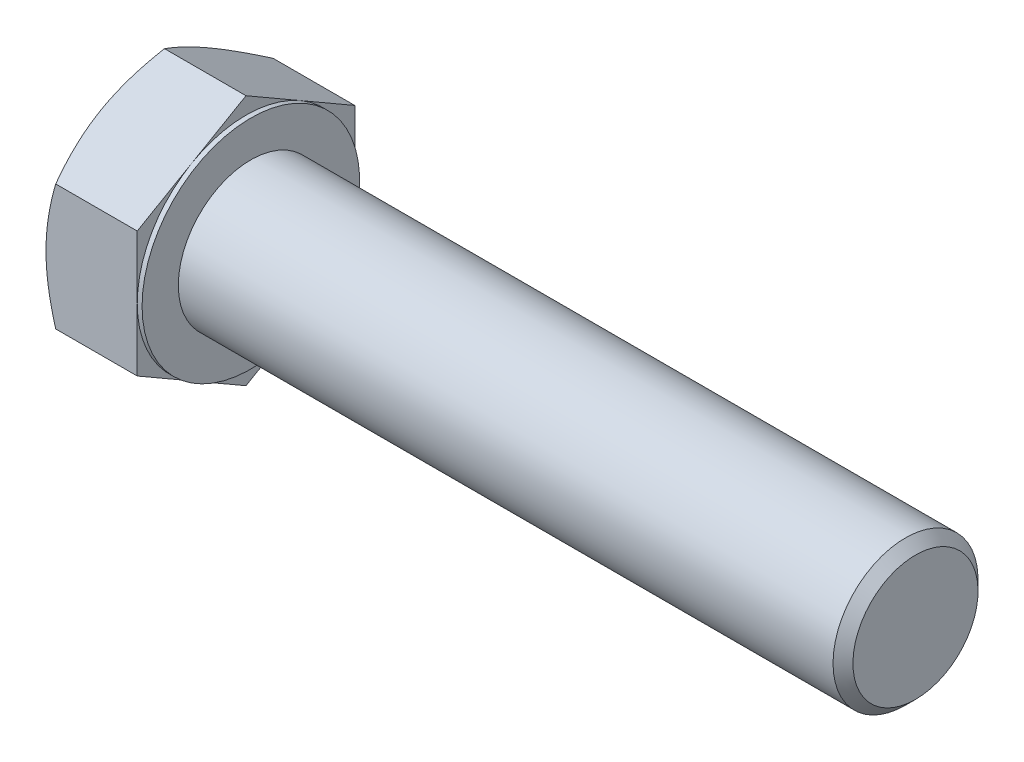
ISO-10303-21;
HEADER;
FILE_DESCRIPTION(('STEP AP214'),'2;1');
FILE_NAME('part.step','',(''),(''),'','','');
FILE_SCHEMA(('AUTOMOTIVE_DESIGN { 1 0 10303 214 1 1 1 1 }'));
ENDSEC;
DATA;
#1=APPLICATION_CONTEXT('core data for automotive mechanical design processes');
#2=APPLICATION_PROTOCOL_DEFINITION('international standard','automotive_design',2000,#1);
#3=PRODUCT_CONTEXT('',#1,'mechanical');
#4=PRODUCT('Part','Part','',(#3));
#5=PRODUCT_RELATED_PRODUCT_CATEGORY('part','',(#4));
#6=PRODUCT_DEFINITION_FORMATION('','',#4);
#7=PRODUCT_DEFINITION_CONTEXT('part definition',#1,'design');
#8=PRODUCT_DEFINITION('design','',#6,#7);
#9=PRODUCT_DEFINITION_SHAPE('','',#8);
#10=(LENGTH_UNIT() NAMED_UNIT(*) SI_UNIT(.MILLI.,.METRE.));
#11=(NAMED_UNIT(*) PLANE_ANGLE_UNIT() SI_UNIT($,.RADIAN.));
#12=(NAMED_UNIT(*) SI_UNIT($,.STERADIAN.) SOLID_ANGLE_UNIT());
#13=UNCERTAINTY_MEASURE_WITH_UNIT(LENGTH_MEASURE(1.E-05),#10,'distance_accuracy_value','');
#14=(GEOMETRIC_REPRESENTATION_CONTEXT(3) GLOBAL_UNCERTAINTY_ASSIGNED_CONTEXT((#13)) GLOBAL_UNIT_ASSIGNED_CONTEXT((#10,
#11,#12)) REPRESENTATION_CONTEXT('',''));
#15=CARTESIAN_POINT('',(0.,0.,0.));
#16=DIRECTION('',(0.,0.,1.));
#17=DIRECTION('',(1.,0.,0.));
#18=AXIS2_PLACEMENT_3D('',#15,#16,#17);
#19=CARTESIAN_POINT('',(0.,20.7846096908265,0.));
#20=DIRECTION('',(1.,0.,0.));
#21=DIRECTION('',(0.,0.,-1.));
#22=AXIS2_PLACEMENT_3D('',#19,#20,#21);
#23=PLANE('',#22);
#24=CARTESIAN_POINT('',(0.,0.,0.));
#25=DIRECTION('',(1.,0.,0.));
#26=DIRECTION('',(0.,0.,-1.));
#27=AXIS2_PLACEMENT_3D('',#24,#25,#26);
#28=CIRCLE('',#27,18.);
#29=CARTESIAN_POINT('',(0.,-15.5884572681199,-9.00000000000001));
#30=VERTEX_POINT('',#29);
#31=CARTESIAN_POINT('',(0.,0.,-18.));
#32=VERTEX_POINT('',#31);
#33=EDGE_CURVE('E85',#30,#32,#28,.T.);
#34=ORIENTED_EDGE('',*,*,#33,.F.);
#35=CARTESIAN_POINT('',(0.,0.,0.));
#36=DIRECTION('',(1.,0.,0.));
#37=DIRECTION('',(0.,1.,0.));
#38=AXIS2_PLACEMENT_3D('',#35,#36,#37);
#39=CIRCLE('',#38,18.);
#40=CARTESIAN_POINT('',(0.,-15.5884572681199,9.00000000000003));
#41=VERTEX_POINT('',#40);
#42=EDGE_CURVE('E20',#41,#30,#39,.T.);
#43=ORIENTED_EDGE('',*,*,#42,.F.);
#44=CARTESIAN_POINT('',(0.,0.,0.));
#45=DIRECTION('',(1.,0.,0.));
#46=DIRECTION('',(0.,1.,0.));
#47=AXIS2_PLACEMENT_3D('',#44,#45,#46);
#48=CIRCLE('',#47,18.);
#49=CARTESIAN_POINT('',(0.,0.,18.));
#50=VERTEX_POINT('',#49);
#51=EDGE_CURVE('E425',#50,#41,#48,.T.);
#52=ORIENTED_EDGE('',*,*,#51,.F.);
#53=CARTESIAN_POINT('',(0.,0.,0.));
#54=DIRECTION('',(1.,0.,0.));
#55=DIRECTION('',(0.,0.,-1.));
#56=AXIS2_PLACEMENT_3D('',#53,#54,#55);
#57=CIRCLE('',#56,18.);
#58=CARTESIAN_POINT('',(0.,15.5884572681199,9.00000000000001));
#59=VERTEX_POINT('',#58);
#60=EDGE_CURVE('E143',#59,#50,#57,.T.);
#61=ORIENTED_EDGE('',*,*,#60,.F.);
#62=CARTESIAN_POINT('',(0.,0.,0.));
#63=DIRECTION('',(1.,0.,0.));
#64=DIRECTION('',(0.,1.,0.));
#65=AXIS2_PLACEMENT_3D('',#62,#63,#64);
#66=CIRCLE('',#65,18.);
#67=CARTESIAN_POINT('',(0.,15.5884572681199,-9.00000000000002));
#68=VERTEX_POINT('',#67);
#69=EDGE_CURVE('E426',#68,#59,#66,.T.);
#70=ORIENTED_EDGE('',*,*,#69,.F.);
#71=CARTESIAN_POINT('',(0.,0.,0.));
#72=DIRECTION('',(1.,0.,0.));
#73=DIRECTION('',(0.,0.,-1.));
#74=AXIS2_PLACEMENT_3D('',#71,#72,#73);
#75=CIRCLE('',#74,18.);
#76=EDGE_CURVE('E88',#32,#68,#75,.T.);
#77=ORIENTED_EDGE('',*,*,#76,.F.);
#78=EDGE_LOOP('',(#34,#43,#52,#61,#70,#77));
#79=FACE_BOUND('',#78,.T.);
#80=ADVANCED_FACE('F17',(#79),#23,.F.);
#81=CARTESIAN_POINT('',(1.61734132551428,0.,0.));
#82=DIRECTION('',(1.,0.,0.));
#83=DIRECTION('',(0.,1.,0.));
#84=AXIS2_PLACEMENT_3D('',#81,#82,#83);
#85=CONICAL_SURFACE('',#84,20.8013173489715,1.0471975511966);
#86=ORIENTED_EDGE('',*,*,#42,.T.);
#87=CARTESIAN_POINT('',(0.,-15.5884572681199,-9.00000000000002));
#88=CARTESIAN_POINT('',(-3.35756924755415E-06,-15.6987310876441,-8.80900014183952));
#89=CARTESIAN_POINT('',(0.00234074693183105,-15.8090014762627,-8.61800622618162));
#90=CARTESIAN_POINT('',(0.0116932881305322,-16.0294911941552,-8.23610683224534));
#91=CARTESIAN_POINT('',(0.018701655132582,-16.1397105241673,-8.04520135268816));
#92=CARTESIAN_POINT('',(0.046672773454852,-16.4701762804104,-7.4728178727134));
#93=CARTESIAN_POINT('',(0.0745815711161496,-16.6902848589415,-7.09157863151587));
#94=CARTESIAN_POINT('',(0.148116143638579,-17.1286410891461,-6.33232336898704));
#95=CARTESIAN_POINT('',(0.193652726206048,-17.3468925444411,-5.95430075959027));
#96=CARTESIAN_POINT('',(0.301492143968027,-17.7823587225169,-5.20005121418521));
#97=CARTESIAN_POINT('',(0.36379542047469,-17.9995734178562,-4.82382432570697));
#98=CARTESIAN_POINT('',(0.503890262513886,-18.4324739665149,-4.07401858080568));
#99=CARTESIAN_POINT('',(0.581663079389066,-18.6481613463536,-3.70043708037356));
#100=CARTESIAN_POINT('',(0.751426501309913,-19.0781398634565,-2.95569244258818));
#101=CARTESIAN_POINT('',(0.843417972803233,-19.2924309148022,-2.58452945405013));
#102=CARTESIAN_POINT('',(1.04074721808793,-19.7206189681177,-1.84288599051373));
#103=CARTESIAN_POINT('',(1.14615098161157,-19.9345083208122,-1.47241876444875));
#104=CARTESIAN_POINT('',(1.36855778804884,-20.3607218802531,-0.734195224622455));
#105=CARTESIAN_POINT('',(1.48555802192809,-20.573046452716,-0.366438277421322));
#106=CARTESIAN_POINT('',(1.60769515458676,-20.7846096908266,0.));
#107=B_SPLINE_CURVE_WITH_KNOTS('',3,(#87,#88,#89,#90,#91,#92,#93,#94,#95,#96,#97,#98,#99,#100,
#101,#102,#103,#104,#105,#106),.UNSPECIFIED.,.F.,.F.,(4,2,2,2,2,2,2,2,2,4),(0.,
0.661616993654727,1.32322410134355,2.64611226449304,3.96239262572098,5.27870763583944,
6.59343692379826,7.90824635953281,9.22979484518,10.5510239884476),.UNSPECIFIED.);
#108=CARTESIAN_POINT('',(1.60769515458676,-20.7846096908266,0.));
#109=VERTEX_POINT('',#108);
#110=EDGE_CURVE('E100',#30,#109,#107,.T.);
#111=ORIENTED_EDGE('',*,*,#110,.T.);
#112=CARTESIAN_POINT('',(1.60769515458675,-20.7846096908266,0.));
#113=CARTESIAN_POINT('',(1.48555802192808,-20.573046452716,0.366438277421322));
#114=CARTESIAN_POINT('',(1.36855778804884,-20.3607218802531,0.734195224622456));
#115=CARTESIAN_POINT('',(1.14615098161157,-19.9345083208122,1.47241876444875));
#116=CARTESIAN_POINT('',(1.04074721808792,-19.7206189681177,1.84288599051374));
#117=CARTESIAN_POINT('',(0.843417972803229,-19.2924309148022,2.58452945405013));
#118=CARTESIAN_POINT('',(0.751426501309909,-19.0781398634565,2.95569244258818));
#119=CARTESIAN_POINT('',(0.581663079389062,-18.6481613463536,3.70043708037356));
#120=CARTESIAN_POINT('',(0.503890262513882,-18.4324739665149,4.07401858080568));
#121=CARTESIAN_POINT('',(0.363795420474685,-17.9995734178562,4.82382432570697));
#122=CARTESIAN_POINT('',(0.301492143968022,-17.7823587225169,5.20005121418521));
#123=CARTESIAN_POINT('',(0.193652726206042,-17.3468925444411,5.95430075959027));
#124=CARTESIAN_POINT('',(0.148116143638574,-17.1286410891461,6.33232336898704));
#125=CARTESIAN_POINT('',(0.0745815711161451,-16.6902848589415,7.09157863151588));
#126=CARTESIAN_POINT('',(0.0466727734548476,-16.4701762804104,7.47281787271341));
#127=CARTESIAN_POINT('',(0.0187016551325777,-16.1397105241673,8.04520135268817));
#128=CARTESIAN_POINT('',(0.011693288130528,-16.0294911941552,8.23610683224535));
#129=CARTESIAN_POINT('',(0.00234074693182661,-15.8090014762627,8.61800622618163));
#130=CARTESIAN_POINT('',(-3.3575692522739E-06,-15.6987310876441,8.80900014183953));
#131=CARTESIAN_POINT('',(0.,-15.5884572681199,9.00000000000003));
#132=B_SPLINE_CURVE_WITH_KNOTS('',3,(#112,#113,#114,#115,#116,#117,#118,#119,#120,#121,#122,
#123,#124,#125,#126,#127,#128,#129,#130,#131),.UNSPECIFIED.,.F.,.F.,(4,2,2,2,2,2,2,2,2,4),(0.,
1.32122914326759,2.64277762891479,3.95758706464934,5.27231635260816,6.58863136272662,
7.90491172395456,9.22779988710406,9.88940699479288,10.5510239884476),.UNSPECIFIED.);
#133=EDGE_CURVE('E106',#109,#41,#132,.T.);
#134=ORIENTED_EDGE('',*,*,#133,.T.);
#135=EDGE_LOOP('',(#86,#111,#134));
#136=FACE_BOUND('',#135,.T.);
#137=ADVANCED_FACE('F104',(#136),#85,.T.);
#138=CARTESIAN_POINT('',(1.61734132551426,0.,0.));
#139=DIRECTION('',(1.,0.,0.));
#140=DIRECTION('',(0.,0.,-1.));
#141=AXIS2_PLACEMENT_3D('',#138,#139,#140);
#142=CONICAL_SURFACE('',#141,20.8013173489715,1.0471975511966);
#143=ORIENTED_EDGE('',*,*,#33,.T.);
#144=CARTESIAN_POINT('',(0.,0.,-18.));
#145=CARTESIAN_POINT('',(-3.35756926385451E-06,-0.22054763904829,-18.));
#146=CARTESIAN_POINT('',(0.00234074693181455,-0.441088416285631,-18.));
#147=CARTESIAN_POINT('',(0.011693288130515,-0.882067852070564,-18.));
#148=CARTESIAN_POINT('',(0.0187016551325642,-1.10250651209479,-18.));
#149=CARTESIAN_POINT('',(0.0466727734548341,-1.76343802458103,-18.));
#150=CARTESIAN_POINT('',(0.0745815711161333,-2.20365518164311,-18.));
#151=CARTESIAN_POINT('',(0.148116143638564,-3.08036764205244,-18.));
#152=CARTESIAN_POINT('',(0.193652726206032,-3.51687055264242,-18.));
#153=CARTESIAN_POINT('',(0.30149214396801,-4.38780290879395,-18.));
#154=CARTESIAN_POINT('',(0.363795420474673,-4.82223229947253,-18.));
#155=CARTESIAN_POINT('',(0.503890262513869,-5.6880333967899,-18.));
#156=CARTESIAN_POINT('',(0.581663079389049,-6.1194081564674,-18.));
#157=CARTESIAN_POINT('',(0.751426501309896,-6.97936519067323,-18.));
#158=CARTESIAN_POINT('',(0.843417972803216,-7.40794729336458,-18.));
#159=CARTESIAN_POINT('',(1.04074721808791,-8.2643233999955,-18.));
#160=CARTESIAN_POINT('',(1.14615098161155,-8.69210210538461,-18.));
#161=CARTESIAN_POINT('',(1.36855778804883,-9.54452922426627,-18.));
#162=CARTESIAN_POINT('',(1.48555802192807,-9.96917836919213,-18.));
#163=CARTESIAN_POINT('',(1.60769515458674,-10.3923048454133,-18.));
#164=B_SPLINE_CURVE_WITH_KNOTS('',3,(#144,#145,#146,#147,#148,#149,#150,#151,#152,#153,#154,
#155,#156,#157,#158,#159,#160,#161,#162,#163),.UNSPECIFIED.,.F.,.F.,(4,2,2,2,2,2,2,2,2,4),(0.,
0.661616993654728,1.32322410134355,2.64611226449304,3.96239262572098,5.27870763583945,
6.59343692379826,7.90824635953281,9.22979484518001,10.5510239884476),.UNSPECIFIED.);
#165=CARTESIAN_POINT('',(1.60769515458674,-10.3923048454133,-18.));
#166=VERTEX_POINT('',#165);
#167=EDGE_CURVE('E95',#32,#166,#164,.T.);
#168=ORIENTED_EDGE('',*,*,#167,.T.);
#169=CARTESIAN_POINT('',(1.60769515458674,-10.3923048454133,-18.));
#170=CARTESIAN_POINT('',(1.48555802192807,-10.6038680835239,-17.6335617225787));
#171=CARTESIAN_POINT('',(1.36855778804883,-10.8161926559868,-17.2658047753776));
#172=CARTESIAN_POINT('',(1.14615098161156,-11.2424062154276,-16.5275812355513));
#173=CARTESIAN_POINT('',(1.04074721808792,-11.4562955681222,-16.1571140094863));
#174=CARTESIAN_POINT('',(0.843417972803223,-11.8844836214376,-15.4154705459499));
#175=CARTESIAN_POINT('',(0.751426501309903,-12.0987746727833,-15.0443075574118));
#176=CARTESIAN_POINT('',(0.581663079389058,-12.5287531898862,-14.2995629196265));
#177=CARTESIAN_POINT('',(0.503890262513879,-12.744440569725,-13.9259814191943));
#178=CARTESIAN_POINT('',(0.363795420474684,-13.1773411183837,-13.1761756742931));
#179=CARTESIAN_POINT('',(0.301492143968022,-13.394555813723,-12.7999487858148));
#180=CARTESIAN_POINT('',(0.193652726206045,-13.8300219917987,-12.0456992404098));
#181=CARTESIAN_POINT('',(0.148116143638577,-14.0482734470937,-11.667676631013));
#182=CARTESIAN_POINT('',(0.0745815711161488,-14.4866296772984,-10.9084213684842));
#183=CARTESIAN_POINT('',(0.0466727734548511,-14.7067382558294,-10.5271821272866));
#184=CARTESIAN_POINT('',(0.0187016551325805,-15.0372040120725,-9.95479864731188));
#185=CARTESIAN_POINT('',(0.0116932881305306,-15.1474233420846,-9.7638931677547));
#186=CARTESIAN_POINT('',(0.00234074693182962,-15.3679130599771,-9.38199377381842));
#187=CARTESIAN_POINT('',(-3.35756924852066E-06,-15.4781834485958,-9.19099985816052));
#188=CARTESIAN_POINT('',(0.,-15.5884572681199,-9.00000000000002));
#189=B_SPLINE_CURVE_WITH_KNOTS('',3,(#169,#170,#171,#172,#173,#174,#175,#176,#177,#178,#179,
#180,#181,#182,#183,#184,#185,#186,#187,#188),.UNSPECIFIED.,.F.,.F.,(4,2,2,2,2,2,2,2,2,4),(0.,
1.32122914326758,2.64277762891477,3.95758706464932,5.27231635260813,6.58863136272659,
7.90491172395452,9.22779988710401,9.88940699479283,10.5510239884476),.UNSPECIFIED.);
#190=EDGE_CURVE('E93',#166,#30,#189,.T.);
#191=ORIENTED_EDGE('',*,*,#190,.T.);
#192=EDGE_LOOP('',(#143,#168,#191));
#193=FACE_BOUND('',#192,.T.);
#194=ADVANCED_FACE('F94',(#193),#142,.T.);
#195=CARTESIAN_POINT('',(1.61734132551425,0.,0.));
#196=DIRECTION('',(1.,0.,0.));
#197=DIRECTION('',(0.,0.,-1.));
#198=AXIS2_PLACEMENT_3D('',#195,#196,#197);
#199=CONICAL_SURFACE('',#198,20.8013173489715,1.0471975511966);
#200=CARTESIAN_POINT('',(1.60769515458673,10.3923048454132,-18.));
#201=CARTESIAN_POINT('',(1.48555802192806,9.96917836919209,-18.));
#202=CARTESIAN_POINT('',(1.36855778804882,9.54452922426623,-18.));
#203=CARTESIAN_POINT('',(1.14615098161154,8.69210210538458,-18.));
#204=CARTESIAN_POINT('',(1.0407472180879,8.26432339999547,-18.));
#205=CARTESIAN_POINT('',(0.843417972803207,7.40794729336454,-18.));
#206=CARTESIAN_POINT('',(0.751426501309888,6.9793651906732,-18.));
#207=CARTESIAN_POINT('',(0.581663079389043,6.11940815646737,-18.));
#208=CARTESIAN_POINT('',(0.503890262513864,5.68803339678988,-18.));
#209=CARTESIAN_POINT('',(0.363795420474669,4.82223229947251,-18.));
#210=CARTESIAN_POINT('',(0.301492143968008,4.38780290879393,-18.));
#211=CARTESIAN_POINT('',(0.19365272620603,3.5168705526424,-18.));
#212=CARTESIAN_POINT('',(0.148116143638561,3.08036764205243,-18.));
#213=CARTESIAN_POINT('',(0.0745815711161315,2.2036551816431,-18.));
#214=CARTESIAN_POINT('',(0.0466727734548338,1.76343802458102,-18.));
#215=CARTESIAN_POINT('',(0.0187016551325645,1.10250651209478,-18.));
#216=CARTESIAN_POINT('',(0.0116932881305151,0.882067852070558,-18.));
#217=CARTESIAN_POINT('',(0.00234074693181456,0.441088416285627,-18.));
#218=CARTESIAN_POINT('',(-3.35756926384848E-06,0.220547639048286,-18.));
#219=CARTESIAN_POINT('',(0.,0.,-18.));
#220=B_SPLINE_CURVE_WITH_KNOTS('',3,(#200,#201,#202,#203,#204,#205,#206,#207,#208,#209,#210,
#211,#212,#213,#214,#215,#216,#217,#218,#219),.UNSPECIFIED.,.F.,.F.,(4,2,2,2,2,2,2,2,2,4),(0.,
1.32122914326759,2.64277762891478,3.95758706464932,5.27231635260813,6.58863136272659,
7.90491172395453,9.22779988710401,9.88940699479283,10.5510239884476),.UNSPECIFIED.);
#221=CARTESIAN_POINT('',(1.60769515458673,10.3923048454132,-18.));
#222=VERTEX_POINT('',#221);
#223=EDGE_CURVE('E114',#222,#32,#220,.T.);
#224=ORIENTED_EDGE('',*,*,#223,.T.);
#225=ORIENTED_EDGE('',*,*,#76,.T.);
#226=CARTESIAN_POINT('',(0.,15.5884572681199,-9.00000000000002));
#227=CARTESIAN_POINT('',(-3.35756926616453E-06,15.4781834485957,-9.19099985816052));
#228=CARTESIAN_POINT('',(0.00234074693181261,15.3679130599771,-9.38199377381842));
#229=CARTESIAN_POINT('',(0.0116932881305136,15.1474233420846,-9.7638931677547));
#230=CARTESIAN_POINT('',(0.018701655132563,15.0372040120725,-9.95479864731188));
#231=CARTESIAN_POINT('',(0.0466727734548326,14.7067382558294,-10.5271821272866));
#232=CARTESIAN_POINT('',(0.0745815711161309,14.4866296772983,-10.9084213684842));
#233=CARTESIAN_POINT('',(0.14811614363856,14.0482734470937,-11.667676631013));
#234=CARTESIAN_POINT('',(0.193652726206028,13.8300219917987,-12.0456992404098));
#235=CARTESIAN_POINT('',(0.301492143968006,13.3945558137229,-12.7999487858148));
#236=CARTESIAN_POINT('',(0.363795420474668,13.1773411183836,-13.1761756742931));
#237=CARTESIAN_POINT('',(0.503890262513864,12.7444405697249,-13.9259814191943));
#238=CARTESIAN_POINT('',(0.581663079389043,12.5287531898862,-14.2995629196265));
#239=CARTESIAN_POINT('',(0.751426501309888,12.0987746727833,-15.0443075574118));
#240=CARTESIAN_POINT('',(0.843417972803206,11.8844836214376,-15.4154705459499));
#241=CARTESIAN_POINT('',(1.0407472180879,11.4562955681221,-16.1571140094863));
#242=CARTESIAN_POINT('',(1.14615098161154,11.2424062154276,-16.5275812355513));
#243=CARTESIAN_POINT('',(1.36855778804882,10.8161926559868,-17.2658047753776));
#244=CARTESIAN_POINT('',(1.48555802192806,10.6038680835238,-17.6335617225787));
#245=CARTESIAN_POINT('',(1.60769515458673,10.3923048454132,-18.));
#246=B_SPLINE_CURVE_WITH_KNOTS('',3,(#226,#227,#228,#229,#230,#231,#232,#233,#234,#235,#236,
#237,#238,#239,#240,#241,#242,#243,#244,#245),.UNSPECIFIED.,.F.,.F.,(4,2,2,2,2,2,2,2,2,4),(0.,
0.661616993654726,1.32322410134354,2.64611226449303,3.96239262572096,5.27870763583943,
6.59343692379823,7.90824635953278,9.22979484517997,10.5510239884476),.UNSPECIFIED.);
#247=EDGE_CURVE('E219',#68,#222,#246,.T.);
#248=ORIENTED_EDGE('',*,*,#247,.T.);
#249=EDGE_LOOP('',(#224,#225,#248));
#250=FACE_BOUND('',#249,.T.);
#251=ADVANCED_FACE('F209',(#250),#199,.T.);
#252=CARTESIAN_POINT('',(1.61734132551426,0.,0.));
#253=DIRECTION('',(1.,0.,0.));
#254=DIRECTION('',(0.,1.,0.));
#255=AXIS2_PLACEMENT_3D('',#252,#253,#254);
#256=CONICAL_SURFACE('',#255,20.8013173489715,1.0471975511966);
#257=CARTESIAN_POINT('',(1.60769515458674,20.7846096908265,0.));
#258=CARTESIAN_POINT('',(1.48555802192807,20.573046452716,-0.366438277421321));
#259=CARTESIAN_POINT('',(1.36855778804883,20.360721880253,-0.734195224622455));
#260=CARTESIAN_POINT('',(1.14615098161155,19.9345083208122,-1.47241876444875));
#261=CARTESIAN_POINT('',(1.04074721808791,19.7206189681176,-1.84288599051373));
#262=CARTESIAN_POINT('',(0.843417972803214,19.2924309148022,-2.58452945405013));
#263=CARTESIAN_POINT('',(0.751426501309894,19.0781398634565,-2.95569244258818));
#264=CARTESIAN_POINT('',(0.581663079389047,18.6481613463536,-3.70043708037355));
#265=CARTESIAN_POINT('',(0.503890262513868,18.4324739665148,-4.07401858080567));
#266=CARTESIAN_POINT('',(0.363795420474672,17.9995734178562,-4.82382432570696));
#267=CARTESIAN_POINT('',(0.301492143968008,17.7823587225169,-5.2000512141852));
#268=CARTESIAN_POINT('',(0.193652726206029,17.3468925444411,-5.95430075959027));
#269=CARTESIAN_POINT('',(0.148116143638562,17.1286410891461,-6.33232336898703));
#270=CARTESIAN_POINT('',(0.0745815711161315,16.6902848589414,-7.09157863151587));
#271=CARTESIAN_POINT('',(0.0466727734548322,16.4701762804104,-7.47281787271339));
#272=CARTESIAN_POINT('',(0.0187016551325632,16.1397105241673,-8.04520135268815));
#273=CARTESIAN_POINT('',(0.0116932881305143,16.0294911941552,-8.23610683224533));
#274=CARTESIAN_POINT('',(0.00234074693181374,15.8090014762627,-8.61800622618161));
#275=CARTESIAN_POINT('',(-3.35756926517944E-06,15.698731087644,-8.80900014183951));
#276=CARTESIAN_POINT('',(0.,15.5884572681199,-9.00000000000001));
#277=B_SPLINE_CURVE_WITH_KNOTS('',3,(#257,#258,#259,#260,#261,#262,#263,#264,#265,#266,#267,
#268,#269,#270,#271,#272,#273,#274,#275,#276),.UNSPECIFIED.,.F.,.F.,(4,2,2,2,2,2,2,2,2,4),(0.,
1.32122914326759,2.64277762891479,3.95758706464934,5.27231635260815,6.58863136272662,
7.90491172395455,9.22779988710404,9.88940699479286,10.5510239884476),.UNSPECIFIED.);
#278=CARTESIAN_POINT('',(1.60769515458674,20.7846096908265,0.));
#279=VERTEX_POINT('',#278);
#280=EDGE_CURVE('E214',#279,#68,#277,.T.);
#281=ORIENTED_EDGE('',*,*,#280,.T.);
#282=ORIENTED_EDGE('',*,*,#69,.T.);
#283=CARTESIAN_POINT('',(0.,15.5884572681199,9.00000000000002));
#284=CARTESIAN_POINT('',(-3.35756926567158E-06,15.698731087644,8.80900014183952));
#285=CARTESIAN_POINT('',(0.00234074693181293,15.8090014762627,8.61800622618161));
#286=CARTESIAN_POINT('',(0.0116932881305142,16.0294911941552,8.23610683224533));
#287=CARTESIAN_POINT('',(0.0187016551325641,16.1397105241673,8.04520135268816));
#288=CARTESIAN_POINT('',(0.0466727734548346,16.4701762804104,7.4728178727134));
#289=CARTESIAN_POINT('',(0.0745815711161326,16.6902848589414,7.09157863151587));
#290=CARTESIAN_POINT('',(0.148116143638562,17.1286410891461,6.33232336898703));
#291=CARTESIAN_POINT('',(0.19365272620603,17.3468925444411,5.95430075959027));
#292=CARTESIAN_POINT('',(0.301492143968008,17.7823587225169,5.2000512141852));
#293=CARTESIAN_POINT('',(0.363795420474671,17.9995734178562,4.82382432570696));
#294=CARTESIAN_POINT('',(0.503890262513868,18.4324739665148,4.07401858080567));
#295=CARTESIAN_POINT('',(0.581663079389048,18.6481613463536,3.70043708037355));
#296=CARTESIAN_POINT('',(0.751426501309894,19.0781398634565,2.95569244258818));
#297=CARTESIAN_POINT('',(0.843417972803214,19.2924309148022,2.58452945405013));
#298=CARTESIAN_POINT('',(1.04074721808791,19.7206189681176,1.84288599051373));
#299=CARTESIAN_POINT('',(1.14615098161155,19.9345083208122,1.47241876444874));
#300=CARTESIAN_POINT('',(1.36855778804883,20.360721880253,0.734195224622453));
#301=CARTESIAN_POINT('',(1.48555802192807,20.573046452716,0.36643827742132));
#302=CARTESIAN_POINT('',(1.60769515458674,20.7846096908265,0.));
#303=B_SPLINE_CURVE_WITH_KNOTS('',3,(#283,#284,#285,#286,#287,#288,#289,#290,#291,#292,#293,
#294,#295,#296,#297,#298,#299,#300,#301,#302),.UNSPECIFIED.,.F.,.F.,(4,2,2,2,2,2,2,2,2,4),(0.,
0.661616993654727,1.32322410134355,2.64611226449304,3.96239262572098,5.27870763583944,
6.59343692379826,7.90824635953281,9.22979484518,10.5510239884476),.UNSPECIFIED.);
#304=EDGE_CURVE('E201',#59,#279,#303,.T.);
#305=ORIENTED_EDGE('',*,*,#304,.T.);
#306=EDGE_LOOP('',(#281,#282,#305));
#307=FACE_BOUND('',#306,.T.);
#308=ADVANCED_FACE('F206',(#307),#256,.T.);
#309=CARTESIAN_POINT('',(1.61734132551425,0.,0.));
#310=DIRECTION('',(1.,0.,0.));
#311=DIRECTION('',(0.,1.,0.));
#312=AXIS2_PLACEMENT_3D('',#309,#310,#311);
#313=CONICAL_SURFACE('',#312,20.8013173489715,1.0471975511966);
#314=ORIENTED_EDGE('',*,*,#51,.T.);
#315=CARTESIAN_POINT('',(0.,-15.5884572681199,9.00000000000003));
#316=CARTESIAN_POINT('',(-3.3575692523705E-06,-15.4781834485958,9.19099985816053));
#317=CARTESIAN_POINT('',(0.00234074693182619,-15.3679130599771,9.38199377381843));
#318=CARTESIAN_POINT('',(0.0116932881305273,-15.1474233420846,9.76389316775471));
#319=CARTESIAN_POINT('',(0.0187016551325771,-15.0372040120725,9.95479864731189));
#320=CARTESIAN_POINT('',(0.0466727734548469,-14.7067382558294,10.5271821272866));
#321=CARTESIAN_POINT('',(0.074581571116144,-14.4866296772984,10.9084213684842));
#322=CARTESIAN_POINT('',(0.148116143638573,-14.0482734470937,11.667676631013));
#323=CARTESIAN_POINT('',(0.193652726206041,-13.8300219917987,12.0456992404098));
#324=CARTESIAN_POINT('',(0.301492143968018,-13.3945558137229,12.7999487858148));
#325=CARTESIAN_POINT('',(0.363795420474679,-13.1773411183836,13.1761756742931));
#326=CARTESIAN_POINT('',(0.503890262513873,-12.744440569725,13.9259814191943));
#327=CARTESIAN_POINT('',(0.581663079389052,-12.5287531898862,14.2995629196265));
#328=CARTESIAN_POINT('',(0.751426501309897,-12.0987746727833,15.0443075574118));
#329=CARTESIAN_POINT('',(0.843417972803216,-11.8844836214376,15.4154705459499));
#330=CARTESIAN_POINT('',(1.04074721808791,-11.4562955681222,16.1571140094863));
#331=CARTESIAN_POINT('',(1.14615098161155,-11.2424062154276,16.5275812355513));
#332=CARTESIAN_POINT('',(1.36855778804882,-10.8161926559868,17.2658047753775));
#333=CARTESIAN_POINT('',(1.48555802192806,-10.6038680835239,17.6335617225787));
#334=CARTESIAN_POINT('',(1.60769515458673,-10.3923048454133,18.));
#335=B_SPLINE_CURVE_WITH_KNOTS('',3,(#315,#316,#317,#318,#319,#320,#321,#322,#323,#324,#325,
#326,#327,#328,#329,#330,#331,#332,#333,#334),.UNSPECIFIED.,.F.,.F.,(4,2,2,2,2,2,2,2,2,4),(0.,
0.661616993654722,1.32322410134354,2.64611226449302,3.96239262572095,5.27870763583941,
6.59343692379821,7.90824635953275,9.22979484517994,10.5510239884475),.UNSPECIFIED.);
#336=CARTESIAN_POINT('',(1.60769515458673,-10.3923048454133,18.));
#337=VERTEX_POINT('',#336);
#338=EDGE_CURVE('E101',#41,#337,#335,.T.);
#339=ORIENTED_EDGE('',*,*,#338,.T.);
#340=CARTESIAN_POINT('',(1.60769515458673,-10.3923048454133,18.));
#341=CARTESIAN_POINT('',(1.48555802192806,-9.96917836919212,18.));
#342=CARTESIAN_POINT('',(1.36855778804882,-9.54452922426626,18.));
#343=CARTESIAN_POINT('',(1.14615098161155,-8.69210210538461,18.));
#344=CARTESIAN_POINT('',(1.0407472180879,-8.2643233999955,18.));
#345=CARTESIAN_POINT('',(0.843417972803208,-7.40794729336457,18.));
#346=CARTESIAN_POINT('',(0.751426501309889,-6.97936519067323,18.));
#347=CARTESIAN_POINT('',(0.581663079389042,-6.11940815646739,18.));
#348=CARTESIAN_POINT('',(0.503890262513862,-5.6880333967899,18.));
#349=CARTESIAN_POINT('',(0.363795420474667,-4.82223229947253,18.));
#350=CARTESIAN_POINT('',(0.301492143968004,-4.38780290879395,18.));
#351=CARTESIAN_POINT('',(0.193652726206025,-3.51687055264242,18.));
#352=CARTESIAN_POINT('',(0.148116143638557,-3.08036764205244,18.));
#353=CARTESIAN_POINT('',(0.0745815711161279,-2.20365518164311,18.));
#354=CARTESIAN_POINT('',(0.0466727734548308,-1.76343802458103,18.));
#355=CARTESIAN_POINT('',(0.0187016551325601,-1.10250651209479,18.));
#356=CARTESIAN_POINT('',(0.0116932881305099,-0.882067852070568,18.));
#357=CARTESIAN_POINT('',(0.00234074693180833,-0.441088416285636,18.));
#358=CARTESIAN_POINT('',(-3.35756927028406E-06,-0.220547639048295,18.));
#359=CARTESIAN_POINT('',(0.,0.,18.));
#360=B_SPLINE_CURVE_WITH_KNOTS('',3,(#340,#341,#342,#343,#344,#345,#346,#347,#348,#349,#350,
#351,#352,#353,#354,#355,#356,#357,#358,#359),.UNSPECIFIED.,.F.,.F.,(4,2,2,2,2,2,2,2,2,4),(0.,
1.32122914326759,2.64277762891478,3.95758706464933,5.27231635260815,6.58863136272661,
7.90491172395455,9.22779988710404,9.88940699479286,10.5510239884476),.UNSPECIFIED.);
#361=EDGE_CURVE('E180',#337,#50,#360,.T.);
#362=ORIENTED_EDGE('',*,*,#361,.T.);
#363=EDGE_LOOP('',(#314,#339,#362));
#364=FACE_BOUND('',#363,.T.);
#365=ADVANCED_FACE('F158',(#364),#313,.T.);
#366=CARTESIAN_POINT('',(1.61734132551425,0.,0.));
#367=DIRECTION('',(1.,0.,0.));
#368=DIRECTION('',(0.,0.,-1.));
#369=AXIS2_PLACEMENT_3D('',#366,#367,#368);
#370=CONICAL_SURFACE('',#369,20.8013173489715,1.0471975511966);
#371=CARTESIAN_POINT('',(1.60769515458673,10.3923048454133,18.));
#372=CARTESIAN_POINT('',(1.48555802192806,10.6038680835238,17.6335617225787));
#373=CARTESIAN_POINT('',(1.36855778804882,10.8161926559868,17.2658047753775));
#374=CARTESIAN_POINT('',(1.14615098161154,11.2424062154276,16.5275812355513));
#375=CARTESIAN_POINT('',(1.0407472180879,11.4562955681221,16.1571140094863));
#376=CARTESIAN_POINT('',(0.843417972803207,11.8844836214376,15.4154705459499));
#377=CARTESIAN_POINT('',(0.751426501309889,12.0987746727833,15.0443075574118));
#378=CARTESIAN_POINT('',(0.581663079389044,12.5287531898862,14.2995629196265));
#379=CARTESIAN_POINT('',(0.503890262513865,12.7444405697249,13.9259814191943));
#380=CARTESIAN_POINT('',(0.363795420474668,13.1773411183836,13.1761756742931));
#381=CARTESIAN_POINT('',(0.301492143968005,13.3945558137229,12.7999487858148));
#382=CARTESIAN_POINT('',(0.193652726206027,13.8300219917987,12.0456992404098));
#383=CARTESIAN_POINT('',(0.148116143638562,14.0482734470937,11.667676631013));
#384=CARTESIAN_POINT('',(0.0745815711161326,14.4866296772983,10.9084213684842));
#385=CARTESIAN_POINT('',(0.0466727734548325,14.7067382558294,10.5271821272866));
#386=CARTESIAN_POINT('',(0.018701655132563,15.0372040120725,9.95479864731187));
#387=CARTESIAN_POINT('',(0.0116932881305141,15.1474233420846,9.7638931677547));
#388=CARTESIAN_POINT('',(0.00234074693181422,15.3679130599771,9.38199377381842));
#389=CARTESIAN_POINT('',(-3.35756926399567E-06,15.4781834485957,9.19099985816052));
#390=CARTESIAN_POINT('',(0.,15.5884572681199,9.00000000000002));
#391=B_SPLINE_CURVE_WITH_KNOTS('',3,(#371,#372,#373,#374,#375,#376,#377,#378,#379,#380,#381,
#382,#383,#384,#385,#386,#387,#388,#389,#390),.UNSPECIFIED.,.F.,.F.,(4,2,2,2,2,2,2,2,2,4),(0.,
1.32122914326759,2.64277762891478,3.95758706464932,5.27231635260813,6.58863136272659,
7.90491172395452,9.22779988710401,9.88940699479283,10.5510239884476),.UNSPECIFIED.);
#392=CARTESIAN_POINT('',(1.60769515458673,10.3923048454133,18.));
#393=VERTEX_POINT('',#392);
#394=EDGE_CURVE('E164',#393,#59,#391,.T.);
#395=ORIENTED_EDGE('',*,*,#394,.T.);
#396=ORIENTED_EDGE('',*,*,#60,.T.);
#397=CARTESIAN_POINT('',(0.,0.,18.));
#398=CARTESIAN_POINT('',(-3.35756926948314E-06,0.220547639048288,18.));
#399=CARTESIAN_POINT('',(0.00234074693180886,0.441088416285629,18.));
#400=CARTESIAN_POINT('',(0.0116932881305092,0.88206785207056,18.));
#401=CARTESIAN_POINT('',(0.0187016551325585,1.10250651209478,18.));
#402=CARTESIAN_POINT('',(0.0466727734548284,1.76343802458102,18.));
#403=CARTESIAN_POINT('',(0.0745815711161281,2.2036551816431,18.));
#404=CARTESIAN_POINT('',(0.148116143638558,3.08036764205243,18.));
#405=CARTESIAN_POINT('',(0.193652726206025,3.5168705526424,18.));
#406=CARTESIAN_POINT('',(0.301492143968002,4.38780290879393,18.));
#407=CARTESIAN_POINT('',(0.363795420474666,4.82223229947251,18.));
#408=CARTESIAN_POINT('',(0.503890262513861,5.68803339678988,18.));
#409=CARTESIAN_POINT('',(0.58166307938904,6.11940815646737,18.));
#410=CARTESIAN_POINT('',(0.751426501309886,6.97936519067321,18.));
#411=CARTESIAN_POINT('',(0.843417972803206,7.40794729336455,18.));
#412=CARTESIAN_POINT('',(1.0407472180879,8.26432339999547,18.));
#413=CARTESIAN_POINT('',(1.14615098161154,8.69210210538458,18.));
#414=CARTESIAN_POINT('',(1.36855778804881,9.54452922426623,18.));
#415=CARTESIAN_POINT('',(1.48555802192806,9.96917836919209,18.));
#416=CARTESIAN_POINT('',(1.60769515458672,10.3923048454133,18.));
#417=B_SPLINE_CURVE_WITH_KNOTS('',3,(#397,#398,#399,#400,#401,#402,#403,#404,#405,#406,#407,
#408,#409,#410,#411,#412,#413,#414,#415,#416),.UNSPECIFIED.,.F.,.F.,(4,2,2,2,2,2,2,2,2,4),(0.,
0.661616993654725,1.32322410134354,2.64611226449303,3.96239262572096,5.27870763583943,
6.59343692379823,7.90824635953278,9.22979484517997,10.5510239884476),.UNSPECIFIED.);
#418=EDGE_CURVE('E172',#50,#393,#417,.T.);
#419=ORIENTED_EDGE('',*,*,#418,.T.);
#420=EDGE_LOOP('',(#395,#396,#419));
#421=FACE_BOUND('',#420,.T.);
#422=ADVANCED_FACE('F153',(#421),#370,.T.);
#423=CARTESIAN_POINT('',(15.9,-20.7846096908266,0.));
#424=DIRECTION('',(0.,0.866025403784438,-0.500000000000001));
#425=DIRECTION('',(0.,0.500000000000001,0.866025403784438));
#426=AXIS2_PLACEMENT_3D('',#423,#424,#425);
#427=PLANE('',#426);
#428=DIRECTION('',(1.,0.,0.));
#429=VECTOR('',#428,1.);
#430=CARTESIAN_POINT('',(15.9,-10.3923048454133,18.));
#431=LINE('',#430,#429);
#432=CARTESIAN_POINT('',(15.1,-10.3923048454133,18.));
#433=VERTEX_POINT('',#432);
#434=EDGE_CURVE('E339',#433,#337,#431,.F.);
#435=ORIENTED_EDGE('',*,*,#434,.T.);
#436=ORIENTED_EDGE('',*,*,#338,.F.);
#437=ORIENTED_EDGE('',*,*,#133,.F.);
#438=DIRECTION('',(1.,0.,0.));
#439=VECTOR('',#438,1.);
#440=CARTESIAN_POINT('',(15.9,-20.7846096908266,0.));
#441=LINE('',#440,#439);
#442=CARTESIAN_POINT('',(15.1,-20.7846096908266,0.));
#443=VERTEX_POINT('',#442);
#444=EDGE_CURVE('E112',#109,#443,#441,.T.);
#445=ORIENTED_EDGE('',*,*,#444,.T.);
#446=DIRECTION('',(0.,-0.500000000000004,-0.866025403784436));
#447=VECTOR('',#446,1.);
#448=CARTESIAN_POINT('',(15.1,-15.5884572681199,9.00000000000001));
#449=LINE('',#448,#447);
#450=CARTESIAN_POINT('',(15.1,-15.5884572681199,9.00000000000002));
#451=VERTEX_POINT('',#450);
#452=EDGE_CURVE('E293',#451,#443,#449,.T.);
#453=ORIENTED_EDGE('',*,*,#452,.F.);
#454=DIRECTION('',(0.,-0.499999999999999,-0.866025403784439));
#455=VECTOR('',#454,1.);
#456=CARTESIAN_POINT('',(15.1,-10.3923048454133,18.));
#457=LINE('',#456,#455);
#458=EDGE_CURVE('E351',#433,#451,#457,.T.);
#459=ORIENTED_EDGE('',*,*,#458,.F.);
#460=EDGE_LOOP('',(#435,#436,#437,#445,#453,#459));
#461=FACE_BOUND('',#460,.T.);
#462=ADVANCED_FACE('F149',(#461),#427,.F.);
#463=CARTESIAN_POINT('',(15.9,-10.3923048454133,-18.));
#464=DIRECTION('',(0.,0.866025403784438,0.500000000000001));
#465=DIRECTION('',(0.,-0.500000000000001,0.866025403784438));
#466=AXIS2_PLACEMENT_3D('',#463,#464,#465);
#467=PLANE('',#466);
#468=ORIENTED_EDGE('',*,*,#444,.F.);
#469=ORIENTED_EDGE('',*,*,#110,.F.);
#470=ORIENTED_EDGE('',*,*,#190,.F.);
#471=DIRECTION('',(1.,0.,0.));
#472=VECTOR('',#471,1.);
#473=CARTESIAN_POINT('',(15.9,-10.3923048454133,-18.));
#474=LINE('',#473,#472);
#475=CARTESIAN_POINT('',(15.1,-10.3923048454133,-18.));
#476=VERTEX_POINT('',#475);
#477=EDGE_CURVE('E220',#166,#476,#474,.T.);
#478=ORIENTED_EDGE('',*,*,#477,.T.);
#479=DIRECTION('',(0.,0.499999999999998,-0.86602540378444));
#480=VECTOR('',#479,1.);
#481=CARTESIAN_POINT('',(15.1,-15.5884572681199,-9.00000000000001));
#482=LINE('',#481,#480);
#483=CARTESIAN_POINT('',(15.1,-15.5884572681199,-9.00000000000001));
#484=VERTEX_POINT('',#483);
#485=EDGE_CURVE('E296',#484,#476,#482,.T.);
#486=ORIENTED_EDGE('',*,*,#485,.F.);
#487=DIRECTION('',(0.,0.500000000000004,-0.866025403784437));
#488=VECTOR('',#487,1.);
#489=CARTESIAN_POINT('',(15.1,-20.7846096908266,0.));
#490=LINE('',#489,#488);
#491=EDGE_CURVE('E287',#443,#484,#490,.T.);
#492=ORIENTED_EDGE('',*,*,#491,.F.);
#493=EDGE_LOOP('',(#468,#469,#470,#478,#486,#492));
#494=FACE_BOUND('',#493,.T.);
#495=ADVANCED_FACE('F109',(#494),#467,.F.);
#496=CARTESIAN_POINT('',(15.9,10.3923048454132,-18.));
#497=DIRECTION('',(0.,0.,1.));
#498=DIRECTION('',(0.,-1.,0.));
#499=AXIS2_PLACEMENT_3D('',#496,#497,#498);
#500=PLANE('',#499);
#501=ORIENTED_EDGE('',*,*,#477,.F.);
#502=ORIENTED_EDGE('',*,*,#167,.F.);
#503=ORIENTED_EDGE('',*,*,#223,.F.);
#504=DIRECTION('',(1.,0.,0.));
#505=VECTOR('',#504,1.);
#506=CARTESIAN_POINT('',(15.9,10.3923048454132,-18.));
#507=LINE('',#506,#505);
#508=CARTESIAN_POINT('',(15.1,10.3923048454132,-18.));
#509=VERTEX_POINT('',#508);
#510=EDGE_CURVE('E332',#222,#509,#507,.T.);
#511=ORIENTED_EDGE('',*,*,#510,.T.);
#512=DIRECTION('',(0.,1.,0.));
#513=VECTOR('',#512,1.);
#514=CARTESIAN_POINT('',(15.1,18.,-18.));
#515=LINE('',#514,#513);
#516=CARTESIAN_POINT('',(15.1,0.,-18.));
#517=VERTEX_POINT('',#516);
#518=EDGE_CURVE('E372',#517,#509,#515,.T.);
#519=ORIENTED_EDGE('',*,*,#518,.F.);
#520=DIRECTION('',(0.,1.,0.));
#521=VECTOR('',#520,1.);
#522=CARTESIAN_POINT('',(15.1,18.,-18.));
#523=LINE('',#522,#521);
#524=EDGE_CURVE('E304',#476,#517,#523,.T.);
#525=ORIENTED_EDGE('',*,*,#524,.F.);
#526=EDGE_LOOP('',(#501,#502,#503,#511,#519,#525));
#527=FACE_BOUND('',#526,.T.);
#528=ADVANCED_FACE('F227',(#527),#500,.F.);
#529=CARTESIAN_POINT('',(15.9,10.3923048454132,-18.));
#530=DIRECTION('',(0.,-0.866025403784438,0.500000000000001));
#531=DIRECTION('',(0.,-0.500000000000001,-0.866025403784438));
#532=AXIS2_PLACEMENT_3D('',#529,#530,#531);
#533=PLANE('',#532);
#534=ORIENTED_EDGE('',*,*,#510,.F.);
#535=ORIENTED_EDGE('',*,*,#247,.F.);
#536=ORIENTED_EDGE('',*,*,#280,.F.);
#537=DIRECTION('',(1.,0.,0.));
#538=VECTOR('',#537,1.);
#539=CARTESIAN_POINT('',(15.9,20.7846096908265,0.));
#540=LINE('',#539,#538);
#541=CARTESIAN_POINT('',(15.1,20.7846096908265,0.));
#542=VERTEX_POINT('',#541);
#543=EDGE_CURVE('E205',#279,#542,#540,.T.);
#544=ORIENTED_EDGE('',*,*,#543,.T.);
#545=DIRECTION('',(0.,0.500000000000001,0.866025403784438));
#546=VECTOR('',#545,1.);
#547=CARTESIAN_POINT('',(15.1,15.5884572681199,-9.00000000000001));
#548=LINE('',#547,#546);
#549=CARTESIAN_POINT('',(15.1,15.5884572681199,-9.00000000000001));
#550=VERTEX_POINT('',#549);
#551=EDGE_CURVE('E377',#550,#542,#548,.T.);
#552=ORIENTED_EDGE('',*,*,#551,.F.);
#553=DIRECTION('',(0.,0.500000000000001,0.866025403784438));
#554=VECTOR('',#553,1.);
#555=CARTESIAN_POINT('',(15.1,10.3923048454132,-18.));
#556=LINE('',#555,#554);
#557=EDGE_CURVE('E367',#509,#550,#556,.T.);
#558=ORIENTED_EDGE('',*,*,#557,.F.);
#559=EDGE_LOOP('',(#534,#535,#536,#544,#552,#558));
#560=FACE_BOUND('',#559,.T.);
#561=ADVANCED_FACE('F197',(#560),#533,.F.);
#562=CARTESIAN_POINT('',(15.9,20.7846096908265,0.));
#563=DIRECTION('',(0.,-0.866025403784438,-0.500000000000001));
#564=DIRECTION('',(0.,0.500000000000001,-0.866025403784438));
#565=AXIS2_PLACEMENT_3D('',#562,#563,#564);
#566=PLANE('',#565);
#567=ORIENTED_EDGE('',*,*,#543,.F.);
#568=ORIENTED_EDGE('',*,*,#304,.F.);
#569=ORIENTED_EDGE('',*,*,#394,.F.);
#570=DIRECTION('',(1.,0.,0.));
#571=VECTOR('',#570,1.);
#572=CARTESIAN_POINT('',(15.9,10.3923048454133,18.));
#573=LINE('',#572,#571);
#574=CARTESIAN_POINT('',(15.1,10.3923048454133,18.));
#575=VERTEX_POINT('',#574);
#576=EDGE_CURVE('E179',#393,#575,#573,.T.);
#577=ORIENTED_EDGE('',*,*,#576,.T.);
#578=DIRECTION('',(0.,-0.500000000000001,0.866025403784438));
#579=VECTOR('',#578,1.);
#580=CARTESIAN_POINT('',(15.1,15.5884572681199,9.00000000000001));
#581=LINE('',#580,#579);
#582=CARTESIAN_POINT('',(15.1,15.5884572681199,9.00000000000002));
#583=VERTEX_POINT('',#582);
#584=EDGE_CURVE('E387',#583,#575,#581,.T.);
#585=ORIENTED_EDGE('',*,*,#584,.F.);
#586=DIRECTION('',(0.,-0.500000000000001,0.866025403784438));
#587=VECTOR('',#586,1.);
#588=CARTESIAN_POINT('',(15.1,20.7846096908265,0.));
#589=LINE('',#588,#587);
#590=EDGE_CURVE('E382',#542,#583,#589,.T.);
#591=ORIENTED_EDGE('',*,*,#590,.F.);
#592=EDGE_LOOP('',(#567,#568,#569,#577,#585,#591));
#593=FACE_BOUND('',#592,.T.);
#594=ADVANCED_FACE('F191',(#593),#566,.F.);
#595=CARTESIAN_POINT('',(15.9,10.3923048454133,18.));
#596=DIRECTION('',(0.,0.,-1.));
#597=DIRECTION('',(0.,1.,0.));
#598=AXIS2_PLACEMENT_3D('',#595,#596,#597);
#599=PLANE('',#598);
#600=ORIENTED_EDGE('',*,*,#576,.F.);
#601=ORIENTED_EDGE('',*,*,#418,.F.);
#602=ORIENTED_EDGE('',*,*,#361,.F.);
#603=ORIENTED_EDGE('',*,*,#434,.F.);
#604=DIRECTION('',(0.,1.,0.));
#605=VECTOR('',#604,1.);
#606=CARTESIAN_POINT('',(15.1,18.,18.));
#607=LINE('',#606,#605);
#608=CARTESIAN_POINT('',(15.1,0.,18.));
#609=VERTEX_POINT('',#608);
#610=EDGE_CURVE('E35',#609,#433,#607,.F.);
#611=ORIENTED_EDGE('',*,*,#610,.F.);
#612=DIRECTION('',(0.,1.,0.));
#613=VECTOR('',#612,1.);
#614=CARTESIAN_POINT('',(15.1,18.,18.));
#615=LINE('',#614,#613);
#616=EDGE_CURVE('E311',#575,#609,#615,.F.);
#617=ORIENTED_EDGE('',*,*,#616,.F.);
#618=EDGE_LOOP('',(#600,#601,#602,#603,#611,#617));
#619=FACE_BOUND('',#618,.T.);
#620=ADVANCED_FACE('F186',(#619),#599,.F.);
#621=CARTESIAN_POINT('',(15.1,18.,0.));
#622=DIRECTION('',(1.,0.,0.));
#623=DIRECTION('',(0.,0.,-1.));
#624=AXIS2_PLACEMENT_3D('',#621,#622,#623);
#625=PLANE('',#624);
#626=ORIENTED_EDGE('',*,*,#458,.T.);
#627=CARTESIAN_POINT('',(15.1,0.,0.));
#628=DIRECTION('',(-1.,0.,0.));
#629=DIRECTION('',(0.,0.,1.));
#630=AXIS2_PLACEMENT_3D('',#627,#628,#629);
#631=CIRCLE('',#630,18.);
#632=EDGE_CURVE('E181',#609,#451,#631,.F.);
#633=ORIENTED_EDGE('',*,*,#632,.F.);
#634=ORIENTED_EDGE('',*,*,#610,.T.);
#635=EDGE_LOOP('',(#626,#633,#634));
#636=FACE_BOUND('',#635,.T.);
#637=ADVANCED_FACE('F190',(#636),#625,.T.);
#638=CARTESIAN_POINT('',(15.1,18.,0.));
#639=DIRECTION('',(1.,0.,0.));
#640=DIRECTION('',(0.,0.,-1.));
#641=AXIS2_PLACEMENT_3D('',#638,#639,#640);
#642=PLANE('',#641);
#643=ORIENTED_EDGE('',*,*,#491,.T.);
#644=CARTESIAN_POINT('',(15.1,0.,0.));
#645=DIRECTION('',(-1.,0.,0.));
#646=DIRECTION('',(0.,0.,1.));
#647=AXIS2_PLACEMENT_3D('',#644,#645,#646);
#648=CIRCLE('',#647,18.);
#649=EDGE_CURVE('E290',#451,#484,#648,.F.);
#650=ORIENTED_EDGE('',*,*,#649,.F.);
#651=ORIENTED_EDGE('',*,*,#452,.T.);
#652=EDGE_LOOP('',(#643,#650,#651));
#653=FACE_BOUND('',#652,.T.);
#654=ADVANCED_FACE('F276',(#653),#642,.T.);
#655=CARTESIAN_POINT('',(15.1,18.,0.));
#656=DIRECTION('',(1.,0.,0.));
#657=DIRECTION('',(0.,0.,-1.));
#658=AXIS2_PLACEMENT_3D('',#655,#656,#657);
#659=PLANE('',#658);
#660=ORIENTED_EDGE('',*,*,#524,.T.);
#661=CARTESIAN_POINT('',(15.1,0.,0.));
#662=DIRECTION('',(-1.,0.,0.));
#663=DIRECTION('',(0.,0.,1.));
#664=AXIS2_PLACEMENT_3D('',#661,#662,#663);
#665=CIRCLE('',#664,18.);
#666=EDGE_CURVE('E301',#484,#517,#665,.F.);
#667=ORIENTED_EDGE('',*,*,#666,.F.);
#668=ORIENTED_EDGE('',*,*,#485,.T.);
#669=EDGE_LOOP('',(#660,#667,#668));
#670=FACE_BOUND('',#669,.T.);
#671=ADVANCED_FACE('F273',(#670),#659,.T.);
#672=CARTESIAN_POINT('',(15.1,18.,0.));
#673=DIRECTION('',(1.,0.,0.));
#674=DIRECTION('',(0.,0.,-1.));
#675=AXIS2_PLACEMENT_3D('',#672,#673,#674);
#676=PLANE('',#675);
#677=CARTESIAN_POINT('',(15.1,0.,0.));
#678=DIRECTION('',(-1.,0.,0.));
#679=DIRECTION('',(0.,0.,1.));
#680=AXIS2_PLACEMENT_3D('',#677,#678,#679);
#681=CIRCLE('',#680,18.);
#682=EDGE_CURVE('E307',#517,#550,#681,.F.);
#683=ORIENTED_EDGE('',*,*,#682,.F.);
#684=ORIENTED_EDGE('',*,*,#518,.T.);
#685=ORIENTED_EDGE('',*,*,#557,.T.);
#686=EDGE_LOOP('',(#683,#684,#685));
#687=FACE_BOUND('',#686,.T.);
#688=ADVANCED_FACE('F269',(#687),#676,.T.);
#689=CARTESIAN_POINT('',(15.1,18.,0.));
#690=DIRECTION('',(1.,0.,0.));
#691=DIRECTION('',(0.,0.,-1.));
#692=AXIS2_PLACEMENT_3D('',#689,#690,#691);
#693=PLANE('',#692);
#694=ORIENTED_EDGE('',*,*,#590,.T.);
#695=CARTESIAN_POINT('',(15.1,0.,0.));
#696=DIRECTION('',(-1.,0.,0.));
#697=DIRECTION('',(0.,0.,1.));
#698=AXIS2_PLACEMENT_3D('',#695,#696,#697);
#699=CIRCLE('',#698,18.);
#700=EDGE_CURVE('E314',#550,#583,#699,.F.);
#701=ORIENTED_EDGE('',*,*,#700,.F.);
#702=ORIENTED_EDGE('',*,*,#551,.T.);
#703=EDGE_LOOP('',(#694,#701,#702));
#704=FACE_BOUND('',#703,.T.);
#705=ADVANCED_FACE('F265',(#704),#693,.T.);
#706=CARTESIAN_POINT('',(15.1,18.,0.));
#707=DIRECTION('',(1.,0.,0.));
#708=DIRECTION('',(0.,0.,-1.));
#709=AXIS2_PLACEMENT_3D('',#706,#707,#708);
#710=PLANE('',#709);
#711=ORIENTED_EDGE('',*,*,#616,.T.);
#712=CARTESIAN_POINT('',(15.1,0.,0.));
#713=DIRECTION('',(-1.,0.,0.));
#714=DIRECTION('',(0.,0.,1.));
#715=AXIS2_PLACEMENT_3D('',#712,#713,#714);
#716=CIRCLE('',#715,18.);
#717=EDGE_CURVE('E317',#583,#609,#716,.F.);
#718=ORIENTED_EDGE('',*,*,#717,.F.);
#719=ORIENTED_EDGE('',*,*,#584,.T.);
#720=EDGE_LOOP('',(#711,#718,#719));
#721=FACE_BOUND('',#720,.T.);
#722=ADVANCED_FACE('F261',(#721),#710,.T.);
#723=CARTESIAN_POINT('',(125.9,0.,0.));
#724=DIRECTION('',(-1.,0.,0.));
#725=DIRECTION('',(0.,0.,1.));
#726=AXIS2_PLACEMENT_3D('',#723,#724,#725);
#727=PLANE('',#726);
#728=CARTESIAN_POINT('',(125.9,0.,0.));
#729=DIRECTION('',(-1.,0.,0.));
#730=DIRECTION('',(0.,-1.,0.));
#731=AXIS2_PLACEMENT_3D('',#728,#729,#730);
#732=CIRCLE('',#731,10.352);
#733=CARTESIAN_POINT('',(125.9,-10.352,0.));
#734=VERTEX_POINT('',#733);
#735=EDGE_CURVE('E319',#734,#734,#732,.T.);
#736=ORIENTED_EDGE('',*,*,#735,.F.);
#737=EDGE_LOOP('',(#736));
#738=FACE_BOUND('',#737,.T.);
#739=ADVANCED_FACE('F257',(#738),#727,.F.);
#740=CARTESIAN_POINT('',(0.,0.,0.));
#741=DIRECTION('',(-1.,0.,0.));
#742=DIRECTION('',(0.,0.,1.));
#743=AXIS2_PLACEMENT_3D('',#740,#741,#742);
#744=CYLINDRICAL_SURFACE('',#743,18.);
#745=ORIENTED_EDGE('',*,*,#666,.T.);
#746=ORIENTED_EDGE('',*,*,#682,.T.);
#747=ORIENTED_EDGE('',*,*,#700,.T.);
#748=ORIENTED_EDGE('',*,*,#717,.T.);
#749=ORIENTED_EDGE('',*,*,#632,.T.);
#750=ORIENTED_EDGE('',*,*,#649,.T.);
#751=EDGE_LOOP('',(#745,#746,#747,#748,#749,#750));
#752=FACE_BOUND('',#751,.T.);
#753=CARTESIAN_POINT('',(15.9,0.,0.));
#754=DIRECTION('',(-1.,0.,0.));
#755=DIRECTION('',(0.,0.,1.));
#756=AXIS2_PLACEMENT_3D('',#753,#754,#755);
#757=CIRCLE('',#756,18.);
#758=CARTESIAN_POINT('',(15.9,0.,18.));
#759=VERTEX_POINT('',#758);
#760=EDGE_CURVE('E322',#759,#759,#757,.F.);
#761=ORIENTED_EDGE('',*,*,#760,.F.);
#762=EDGE_LOOP('',(#761));
#763=FACE_BOUND('',#762,.T.);
#764=ADVANCED_FACE('F253',(#752,#763),#744,.T.);
#765=CARTESIAN_POINT('',(124.252,0.,0.));
#766=DIRECTION('',(-1.,0.,0.));
#767=DIRECTION('',(0.,-1.,0.));
#768=AXIS2_PLACEMENT_3D('',#765,#766,#767);
#769=CONICAL_SURFACE('',#768,12.,0.785398163397436);
#770=CARTESIAN_POINT('',(124.252,0.,0.));
#771=DIRECTION('',(-1.,0.,0.));
#772=DIRECTION('',(0.,0.,1.));
#773=AXIS2_PLACEMENT_3D('',#770,#771,#772);
#774=CIRCLE('',#773,12.);
#775=CARTESIAN_POINT('',(124.252,0.,12.));
#776=VERTEX_POINT('',#775);
#777=EDGE_CURVE('E26',#776,#776,#774,.T.);
#778=ORIENTED_EDGE('',*,*,#777,.F.);
#779=EDGE_LOOP('',(#778));
#780=FACE_BOUND('',#779,.T.);
#781=ORIENTED_EDGE('',*,*,#735,.T.);
#782=EDGE_LOOP('',(#781));
#783=FACE_BOUND('',#782,.T.);
#784=ADVANCED_FACE('F246',(#780,#783),#769,.T.);
#785=CARTESIAN_POINT('',(15.9,20.7846096908265,0.));
#786=DIRECTION('',(1.,0.,0.));
#787=DIRECTION('',(0.,0.,-1.));
#788=AXIS2_PLACEMENT_3D('',#785,#786,#787);
#789=PLANE('',#788);
#790=ORIENTED_EDGE('',*,*,#760,.T.);
#791=EDGE_LOOP('',(#790));
#792=FACE_BOUND('',#791,.T.);
#793=CARTESIAN_POINT('',(15.9,0.,0.));
#794=DIRECTION('',(-1.,0.,0.));
#795=DIRECTION('',(0.,0.,1.));
#796=AXIS2_PLACEMENT_3D('',#793,#794,#795);
#797=CIRCLE('',#796,12.);
#798=CARTESIAN_POINT('',(15.9,0.,12.));
#799=VERTEX_POINT('',#798);
#800=EDGE_CURVE('E11',#799,#799,#797,.F.);
#801=ORIENTED_EDGE('',*,*,#800,.F.);
#802=EDGE_LOOP('',(#801));
#803=FACE_BOUND('',#802,.T.);
#804=ADVANCED_FACE('F240',(#792,#803),#789,.T.);
#805=CARTESIAN_POINT('',(0.,0.,0.));
#806=DIRECTION('',(-1.,0.,0.));
#807=DIRECTION('',(0.,0.,1.));
#808=AXIS2_PLACEMENT_3D('',#805,#806,#807);
#809=CYLINDRICAL_SURFACE('',#808,12.);
#810=ORIENTED_EDGE('',*,*,#800,.T.);
#811=EDGE_LOOP('',(#810));
#812=FACE_BOUND('',#811,.T.);
#813=ORIENTED_EDGE('',*,*,#777,.T.);
#814=EDGE_LOOP('',(#813));
#815=FACE_BOUND('',#814,.T.);
#816=ADVANCED_FACE('F238',(#812,#815),#809,.T.);
#817=CLOSED_SHELL('',(#80,#137,#194,#251,#308,#365,#422,#462,#495,#528,#561,#594,#620,#637,#654,
#671,#688,#705,#722,#739,#764,#784,#804,#816));
#818=MANIFOLD_SOLID_BREP('B1',#817);
#819=ADVANCED_BREP_SHAPE_REPRESENTATION('',(#18,#818),#14);
#820=SHAPE_DEFINITION_REPRESENTATION(#9,#819);
ENDSEC;
END-ISO-10303-21;
